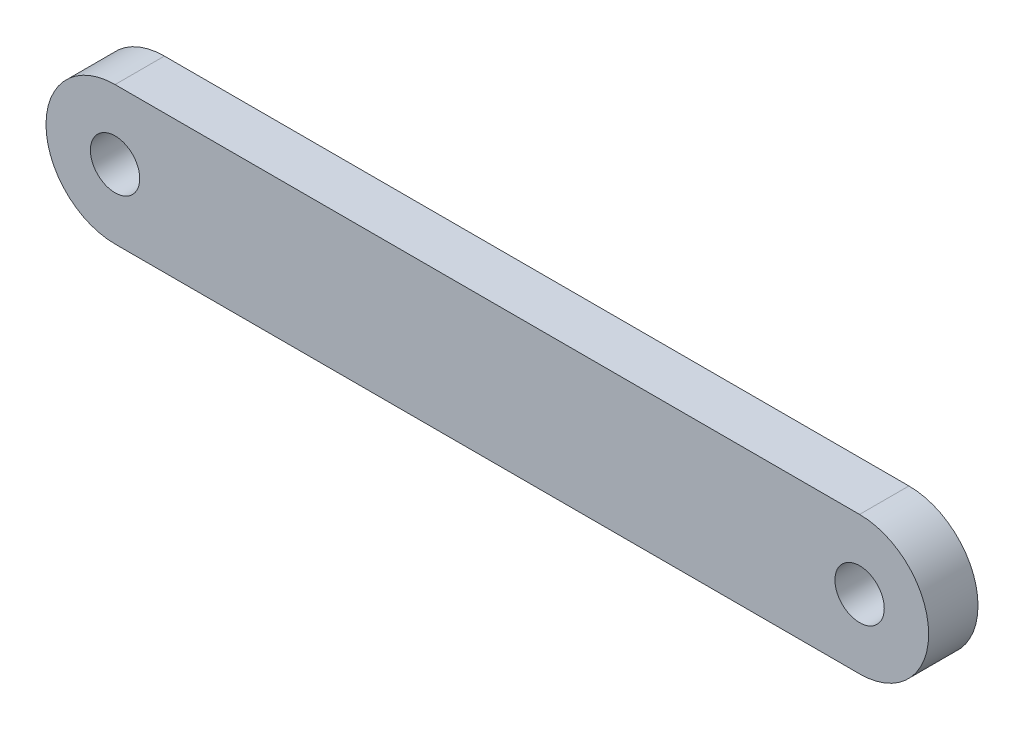
ISO-10303-21;
HEADER;
FILE_DESCRIPTION(('STEP AP214'),'2;1');
FILE_NAME('part.step','',(''),(''),'','','');
FILE_SCHEMA(('AUTOMOTIVE_DESIGN { 1 0 10303 214 1 1 1 1 }'));
ENDSEC;
DATA;
#1=APPLICATION_CONTEXT('core data for automotive mechanical design processes');
#2=APPLICATION_PROTOCOL_DEFINITION('international standard','automotive_design',2000,#1);
#3=PRODUCT_CONTEXT('',#1,'mechanical');
#4=PRODUCT('Part','Part','',(#3));
#5=PRODUCT_RELATED_PRODUCT_CATEGORY('part','',(#4));
#6=PRODUCT_DEFINITION_FORMATION('','',#4);
#7=PRODUCT_DEFINITION_CONTEXT('part definition',#1,'design');
#8=PRODUCT_DEFINITION('design','',#6,#7);
#9=PRODUCT_DEFINITION_SHAPE('','',#8);
#10=(LENGTH_UNIT() NAMED_UNIT(*) SI_UNIT(.MILLI.,.METRE.));
#11=(NAMED_UNIT(*) PLANE_ANGLE_UNIT() SI_UNIT($,.RADIAN.));
#12=(NAMED_UNIT(*) SI_UNIT($,.STERADIAN.) SOLID_ANGLE_UNIT());
#13=UNCERTAINTY_MEASURE_WITH_UNIT(LENGTH_MEASURE(1.E-05),#10,'distance_accuracy_value','');
#14=(GEOMETRIC_REPRESENTATION_CONTEXT(3) GLOBAL_UNCERTAINTY_ASSIGNED_CONTEXT((#13)) GLOBAL_UNIT_ASSIGNED_CONTEXT((#10,
#11,#12)) REPRESENTATION_CONTEXT('',''));
#15=CARTESIAN_POINT('',(0.,0.,0.));
#16=DIRECTION('',(0.,0.,1.));
#17=DIRECTION('',(1.,0.,0.));
#18=AXIS2_PLACEMENT_3D('',#15,#16,#17);
#19=CARTESIAN_POINT('',(32.6389983315269,0.0828935564845812,6.35));
#20=DIRECTION('',(0.,0.,-1.));
#21=DIRECTION('',(-1.,0.,0.));
#22=AXIS2_PLACEMENT_3D('',#19,#20,#21);
#23=PLANE('',#22);
#24=CARTESIAN_POINT('',(32.6389983315269,0.0828935564845812,6.35));
#25=DIRECTION('',(0.,0.,1.));
#26=DIRECTION('',(-1.,0.,0.));
#27=AXIS2_PLACEMENT_3D('',#24,#25,#26);
#28=CIRCLE('',#27,8.89);
#29=CARTESIAN_POINT('',(32.6389983315269,-8.80710644351542,6.35));
#30=VERTEX_POINT('',#29);
#31=CARTESIAN_POINT('',(32.6389983315269,8.97289355648458,6.35));
#32=VERTEX_POINT('',#31);
#33=EDGE_CURVE('E98',#30,#32,#28,.T.);
#34=ORIENTED_EDGE('',*,*,#33,.T.);
#35=DIRECTION('',(-1.,0.,0.));
#36=VECTOR('',#35,1.);
#37=CARTESIAN_POINT('',(-63.1952016684731,8.97289355648458,6.35));
#38=LINE('',#37,#36);
#39=CARTESIAN_POINT('',(-63.1952016684731,8.97289355648458,6.35));
#40=VERTEX_POINT('',#39);
#41=EDGE_CURVE('E91',#32,#40,#38,.T.);
#42=ORIENTED_EDGE('',*,*,#41,.T.);
#43=CARTESIAN_POINT('',(-63.1952016684731,0.0828935564845812,6.35));
#44=DIRECTION('',(0.,0.,1.));
#45=DIRECTION('',(1.,0.,0.));
#46=AXIS2_PLACEMENT_3D('',#43,#44,#45);
#47=CIRCLE('',#46,8.89);
#48=CARTESIAN_POINT('',(-63.1952016684731,-8.80710644351542,6.35));
#49=VERTEX_POINT('',#48);
#50=EDGE_CURVE('E96',#40,#49,#47,.T.);
#51=ORIENTED_EDGE('',*,*,#50,.T.);
#52=DIRECTION('',(1.,0.,0.));
#53=VECTOR('',#52,1.);
#54=CARTESIAN_POINT('',(-63.1952016684731,-8.80710644351542,6.35));
#55=LINE('',#54,#53);
#56=EDGE_CURVE('E64',#49,#30,#55,.T.);
#57=ORIENTED_EDGE('',*,*,#56,.T.);
#58=EDGE_LOOP('',(#34,#42,#51,#57));
#59=FACE_BOUND('',#58,.T.);
#60=CARTESIAN_POINT('',(-63.1952016684731,0.0828935564845812,6.35));
#61=DIRECTION('',(0.,0.,1.));
#62=DIRECTION('',(1.,0.,0.));
#63=AXIS2_PLACEMENT_3D('',#60,#61,#62);
#64=CIRCLE('',#63,3.175);
#65=CARTESIAN_POINT('',(-60.0202016684731,0.0828935564845812,6.35));
#66=VERTEX_POINT('',#65);
#67=EDGE_CURVE('E119',#66,#66,#64,.T.);
#68=ORIENTED_EDGE('',*,*,#67,.F.);
#69=EDGE_LOOP('',(#68));
#70=FACE_BOUND('',#69,.T.);
#71=CARTESIAN_POINT('',(32.6389983315269,0.0828935564845812,6.35));
#72=DIRECTION('',(0.,0.,1.));
#73=DIRECTION('',(1.,0.,0.));
#74=AXIS2_PLACEMENT_3D('',#71,#72,#73);
#75=CIRCLE('',#74,3.175);
#76=CARTESIAN_POINT('',(35.8139983315269,0.0828935564845812,6.35));
#77=VERTEX_POINT('',#76);
#78=EDGE_CURVE('E138',#77,#77,#75,.T.);
#79=ORIENTED_EDGE('',*,*,#78,.F.);
#80=EDGE_LOOP('',(#79));
#81=FACE_BOUND('',#80,.T.);
#82=ADVANCED_FACE('F44',(#59,#70,#81),#23,.F.);
#83=CARTESIAN_POINT('',(32.6389983315269,0.0828935564845812,0.));
#84=DIRECTION('',(0.,0.,-1.));
#85=DIRECTION('',(-1.,0.,0.));
#86=AXIS2_PLACEMENT_3D('',#83,#84,#85);
#87=PLANE('',#86);
#88=CARTESIAN_POINT('',(-63.1952016684731,0.0828935564845812,0.));
#89=DIRECTION('',(0.,0.,1.));
#90=DIRECTION('',(1.,0.,0.));
#91=AXIS2_PLACEMENT_3D('',#88,#89,#90);
#92=CIRCLE('',#91,3.175);
#93=CARTESIAN_POINT('',(-60.0202016684731,0.0828935564845812,0.));
#94=VERTEX_POINT('',#93);
#95=EDGE_CURVE('E137',#94,#94,#92,.T.);
#96=ORIENTED_EDGE('',*,*,#95,.T.);
#97=EDGE_LOOP('',(#96));
#98=FACE_BOUND('',#97,.T.);
#99=CARTESIAN_POINT('',(32.6389983315269,0.0828935564845812,0.));
#100=DIRECTION('',(0.,0.,1.));
#101=DIRECTION('',(-1.,0.,0.));
#102=AXIS2_PLACEMENT_3D('',#99,#100,#101);
#103=CIRCLE('',#102,8.89);
#104=CARTESIAN_POINT('',(32.6389983315269,-8.80710644351542,0.));
#105=VERTEX_POINT('',#104);
#106=CARTESIAN_POINT('',(32.6389983315269,8.97289355648458,0.));
#107=VERTEX_POINT('',#106);
#108=EDGE_CURVE('E111',#105,#107,#103,.T.);
#109=ORIENTED_EDGE('',*,*,#108,.F.);
#110=DIRECTION('',(1.,0.,0.));
#111=VECTOR('',#110,1.);
#112=CARTESIAN_POINT('',(-63.1952016684731,-8.80710644351542,0.));
#113=LINE('',#112,#111);
#114=CARTESIAN_POINT('',(-63.1952016684731,-8.80710644351542,0.));
#115=VERTEX_POINT('',#114);
#116=EDGE_CURVE('E88',#115,#105,#113,.T.);
#117=ORIENTED_EDGE('',*,*,#116,.F.);
#118=CARTESIAN_POINT('',(-63.1952016684731,0.0828935564845812,0.));
#119=DIRECTION('',(0.,0.,1.));
#120=DIRECTION('',(1.,0.,0.));
#121=AXIS2_PLACEMENT_3D('',#118,#119,#120);
#122=CIRCLE('',#121,8.89);
#123=CARTESIAN_POINT('',(-63.1952016684731,8.97289355648458,0.));
#124=VERTEX_POINT('',#123);
#125=EDGE_CURVE('E78',#124,#115,#122,.T.);
#126=ORIENTED_EDGE('',*,*,#125,.F.);
#127=DIRECTION('',(-1.,0.,0.));
#128=VECTOR('',#127,1.);
#129=CARTESIAN_POINT('',(-63.1952016684731,8.97289355648458,0.));
#130=LINE('',#129,#128);
#131=EDGE_CURVE('E103',#107,#124,#130,.T.);
#132=ORIENTED_EDGE('',*,*,#131,.F.);
#133=EDGE_LOOP('',(#109,#117,#126,#132));
#134=FACE_BOUND('',#133,.T.);
#135=CARTESIAN_POINT('',(32.6389983315269,0.0828935564845812,0.));
#136=DIRECTION('',(0.,0.,1.));
#137=DIRECTION('',(1.,0.,0.));
#138=AXIS2_PLACEMENT_3D('',#135,#136,#137);
#139=CIRCLE('',#138,3.175);
#140=CARTESIAN_POINT('',(35.8139983315269,0.0828935564845812,0.));
#141=VERTEX_POINT('',#140);
#142=EDGE_CURVE('E145',#141,#141,#139,.T.);
#143=ORIENTED_EDGE('',*,*,#142,.T.);
#144=EDGE_LOOP('',(#143));
#145=FACE_BOUND('',#144,.T.);
#146=ADVANCED_FACE('F132',(#98,#134,#145),#87,.T.);
#147=CARTESIAN_POINT('',(32.6389983315269,0.0828935564845812,6.35));
#148=DIRECTION('',(0.,0.,-1.));
#149=DIRECTION('',(-1.,0.,0.));
#150=AXIS2_PLACEMENT_3D('',#147,#148,#149);
#151=CYLINDRICAL_SURFACE('',#150,8.89);
#152=ORIENTED_EDGE('',*,*,#108,.T.);
#153=DIRECTION('',(0.,0.,-1.));
#154=VECTOR('',#153,1.);
#155=CARTESIAN_POINT('',(32.6389983315269,8.97289355648458,6.35));
#156=LINE('',#155,#154);
#157=EDGE_CURVE('E11',#32,#107,#156,.T.);
#158=ORIENTED_EDGE('',*,*,#157,.F.);
#159=ORIENTED_EDGE('',*,*,#33,.F.);
#160=DIRECTION('',(0.,0.,-1.));
#161=VECTOR('',#160,1.);
#162=CARTESIAN_POINT('',(32.6389983315269,-8.80710644351542,6.35));
#163=LINE('',#162,#161);
#164=EDGE_CURVE('E109',#30,#105,#163,.T.);
#165=ORIENTED_EDGE('',*,*,#164,.T.);
#166=EDGE_LOOP('',(#152,#158,#159,#165));
#167=FACE_BOUND('',#166,.T.);
#168=ADVANCED_FACE('F50',(#167),#151,.T.);
#169=CARTESIAN_POINT('',(-63.1952016684731,8.97289355648458,6.35));
#170=DIRECTION('',(0.,-1.,0.));
#171=DIRECTION('',(0.,0.,-1.));
#172=AXIS2_PLACEMENT_3D('',#169,#170,#171);
#173=PLANE('',#172);
#174=ORIENTED_EDGE('',*,*,#131,.T.);
#175=DIRECTION('',(0.,0.,-1.));
#176=VECTOR('',#175,1.);
#177=CARTESIAN_POINT('',(-63.1952016684731,8.97289355648458,6.35));
#178=LINE('',#177,#176);
#179=EDGE_CURVE('E54',#40,#124,#178,.T.);
#180=ORIENTED_EDGE('',*,*,#179,.F.);
#181=ORIENTED_EDGE('',*,*,#41,.F.);
#182=ORIENTED_EDGE('',*,*,#157,.T.);
#183=EDGE_LOOP('',(#174,#180,#181,#182));
#184=FACE_BOUND('',#183,.T.);
#185=ADVANCED_FACE('F105',(#184),#173,.F.);
#186=CARTESIAN_POINT('',(-63.1952016684731,0.0828935564845812,6.35));
#187=DIRECTION('',(0.,0.,-1.));
#188=DIRECTION('',(-1.,0.,0.));
#189=AXIS2_PLACEMENT_3D('',#186,#187,#188);
#190=CYLINDRICAL_SURFACE('',#189,8.89);
#191=ORIENTED_EDGE('',*,*,#125,.T.);
#192=DIRECTION('',(0.,0.,-1.));
#193=VECTOR('',#192,1.);
#194=CARTESIAN_POINT('',(-63.1952016684731,-8.80710644351542,6.35));
#195=LINE('',#194,#193);
#196=EDGE_CURVE('E104',#49,#115,#195,.T.);
#197=ORIENTED_EDGE('',*,*,#196,.F.);
#198=ORIENTED_EDGE('',*,*,#50,.F.);
#199=ORIENTED_EDGE('',*,*,#179,.T.);
#200=EDGE_LOOP('',(#191,#197,#198,#199));
#201=FACE_BOUND('',#200,.T.);
#202=ADVANCED_FACE('F106',(#201),#190,.T.);
#203=CARTESIAN_POINT('',(-63.1952016684731,-8.80710644351542,6.35));
#204=DIRECTION('',(0.,1.,0.));
#205=DIRECTION('',(0.,0.,1.));
#206=AXIS2_PLACEMENT_3D('',#203,#204,#205);
#207=PLANE('',#206);
#208=ORIENTED_EDGE('',*,*,#116,.T.);
#209=ORIENTED_EDGE('',*,*,#164,.F.);
#210=ORIENTED_EDGE('',*,*,#56,.F.);
#211=ORIENTED_EDGE('',*,*,#196,.T.);
#212=EDGE_LOOP('',(#208,#209,#210,#211));
#213=FACE_BOUND('',#212,.T.);
#214=ADVANCED_FACE('F126',(#213),#207,.F.);
#215=CARTESIAN_POINT('',(-63.1952016684731,0.0828935564845812,6.35));
#216=DIRECTION('',(0.,0.,-1.));
#217=DIRECTION('',(-1.,0.,0.));
#218=AXIS2_PLACEMENT_3D('',#215,#216,#217);
#219=CYLINDRICAL_SURFACE('',#218,3.175);
#220=ORIENTED_EDGE('',*,*,#67,.T.);
#221=EDGE_LOOP('',(#220));
#222=FACE_BOUND('',#221,.T.);
#223=ORIENTED_EDGE('',*,*,#95,.F.);
#224=EDGE_LOOP('',(#223));
#225=FACE_BOUND('',#224,.T.);
#226=ADVANCED_FACE('F162',(#222,#225),#219,.F.);
#227=CARTESIAN_POINT('',(32.6389983315269,0.0828935564845812,6.35));
#228=DIRECTION('',(0.,0.,-1.));
#229=DIRECTION('',(-1.,0.,0.));
#230=AXIS2_PLACEMENT_3D('',#227,#228,#229);
#231=CYLINDRICAL_SURFACE('',#230,3.175);
#232=ORIENTED_EDGE('',*,*,#78,.T.);
#233=EDGE_LOOP('',(#232));
#234=FACE_BOUND('',#233,.T.);
#235=ORIENTED_EDGE('',*,*,#142,.F.);
#236=EDGE_LOOP('',(#235));
#237=FACE_BOUND('',#236,.T.);
#238=ADVANCED_FACE('F155',(#234,#237),#231,.F.);
#239=CLOSED_SHELL('',(#82,#146,#168,#185,#202,#214,#226,#238));
#240=MANIFOLD_SOLID_BREP('B2',#239);
#241=ADVANCED_BREP_SHAPE_REPRESENTATION('',(#18,#240),#14);
#242=SHAPE_DEFINITION_REPRESENTATION(#9,#241);
ENDSEC;
END-ISO-10303-21;
